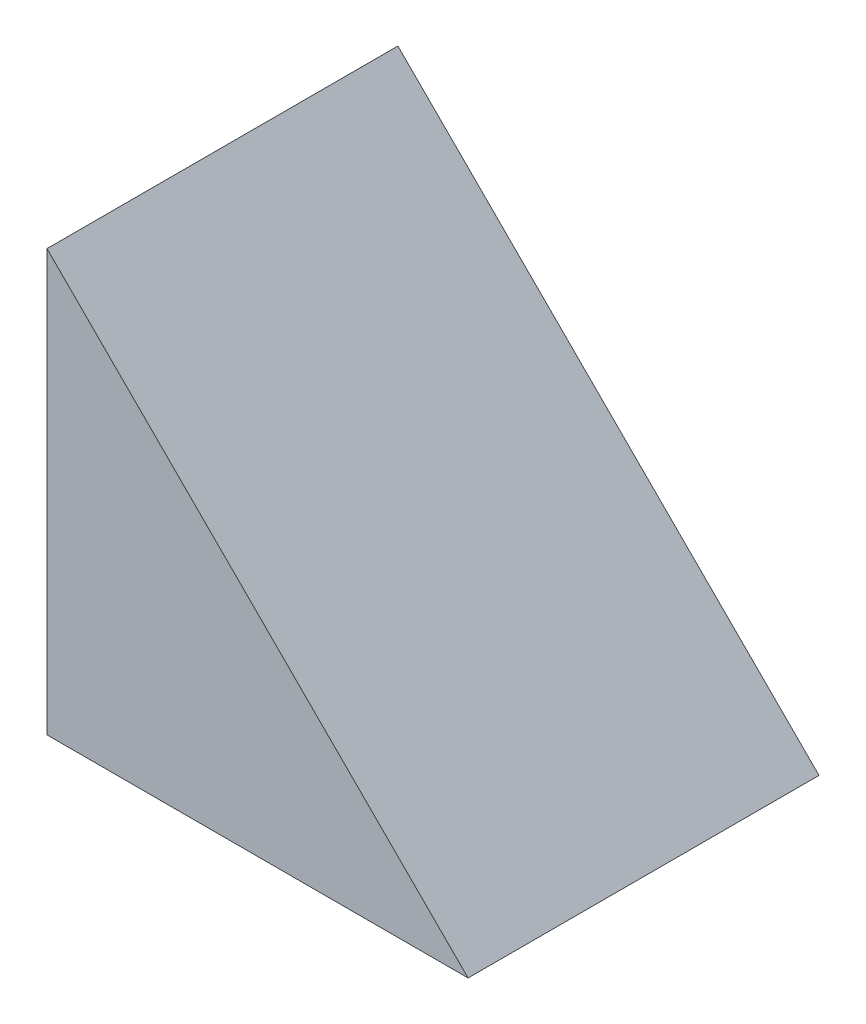
ISO-10303-21;
HEADER;
FILE_DESCRIPTION(('STEP AP214'),'2;1');
FILE_NAME('part.step','',(''),(''),'','','');
FILE_SCHEMA(('AUTOMOTIVE_DESIGN { 1 0 10303 214 1 1 1 1 }'));
ENDSEC;
DATA;
#1=APPLICATION_CONTEXT('core data for automotive mechanical design processes');
#2=APPLICATION_PROTOCOL_DEFINITION('international standard','automotive_design',2000,#1);
#3=PRODUCT_CONTEXT('',#1,'mechanical');
#4=PRODUCT('Part','Part','',(#3));
#5=PRODUCT_RELATED_PRODUCT_CATEGORY('part','',(#4));
#6=PRODUCT_DEFINITION_FORMATION('','',#4);
#7=PRODUCT_DEFINITION_CONTEXT('part definition',#1,'design');
#8=PRODUCT_DEFINITION('design','',#6,#7);
#9=PRODUCT_DEFINITION_SHAPE('','',#8);
#10=(LENGTH_UNIT() NAMED_UNIT(*) SI_UNIT(.MILLI.,.METRE.));
#11=(NAMED_UNIT(*) PLANE_ANGLE_UNIT() SI_UNIT($,.RADIAN.));
#12=(NAMED_UNIT(*) SI_UNIT($,.STERADIAN.) SOLID_ANGLE_UNIT());
#13=UNCERTAINTY_MEASURE_WITH_UNIT(LENGTH_MEASURE(1.E-05),#10,'distance_accuracy_value','');
#14=(GEOMETRIC_REPRESENTATION_CONTEXT(3) GLOBAL_UNCERTAINTY_ASSIGNED_CONTEXT((#13)) GLOBAL_UNIT_ASSIGNED_CONTEXT((#10,
#11,#12)) REPRESENTATION_CONTEXT('',''));
#15=CARTESIAN_POINT('',(0.,0.,0.));
#16=DIRECTION('',(0.,0.,1.));
#17=DIRECTION('',(1.,0.,0.));
#18=AXIS2_PLACEMENT_3D('',#15,#16,#17);
#19=CARTESIAN_POINT('',(0.,76.2,63.5));
#20=DIRECTION('',(1.,0.,0.));
#21=DIRECTION('',(0.,0.,-1.));
#22=AXIS2_PLACEMENT_3D('',#19,#20,#21);
#23=PLANE('',#22);
#24=DIRECTION('',(0.,-1.,0.));
#25=VECTOR('',#24,1.);
#26=CARTESIAN_POINT('',(0.,76.2,0.));
#27=LINE('',#26,#25);
#28=CARTESIAN_POINT('',(0.,76.2,0.));
#29=VERTEX_POINT('',#28);
#30=CARTESIAN_POINT('',(0.,0.,0.));
#31=VERTEX_POINT('',#30);
#32=EDGE_CURVE('E80',#29,#31,#27,.T.);
#33=ORIENTED_EDGE('',*,*,#32,.T.);
#34=DIRECTION('',(0.,0.,-1.));
#35=VECTOR('',#34,1.);
#36=CARTESIAN_POINT('',(0.,0.,63.5));
#37=LINE('',#36,#35);
#38=CARTESIAN_POINT('',(0.,0.,63.5));
#39=VERTEX_POINT('',#38);
#40=EDGE_CURVE('E11',#39,#31,#37,.T.);
#41=ORIENTED_EDGE('',*,*,#40,.F.);
#42=DIRECTION('',(0.,-1.,0.));
#43=VECTOR('',#42,1.);
#44=CARTESIAN_POINT('',(0.,76.2,63.5));
#45=LINE('',#44,#43);
#46=CARTESIAN_POINT('',(0.,76.2,63.5));
#47=VERTEX_POINT('',#46);
#48=EDGE_CURVE('E73',#47,#39,#45,.T.);
#49=ORIENTED_EDGE('',*,*,#48,.F.);
#50=DIRECTION('',(0.,0.,-1.));
#51=VECTOR('',#50,1.);
#52=CARTESIAN_POINT('',(0.,76.2,63.5));
#53=LINE('',#52,#51);
#54=EDGE_CURVE('E81',#47,#29,#53,.T.);
#55=ORIENTED_EDGE('',*,*,#54,.T.);
#56=EDGE_LOOP('',(#33,#41,#49,#55));
#57=FACE_BOUND('',#56,.T.);
#58=ADVANCED_FACE('F33',(#57),#23,.F.);
#59=CARTESIAN_POINT('',(0.,0.,63.5));
#60=DIRECTION('',(0.,1.,0.));
#61=DIRECTION('',(0.,0.,1.));
#62=AXIS2_PLACEMENT_3D('',#59,#60,#61);
#63=PLANE('',#62);
#64=DIRECTION('',(1.,0.,0.));
#65=VECTOR('',#64,1.);
#66=CARTESIAN_POINT('',(0.,0.,0.));
#67=LINE('',#66,#65);
#68=CARTESIAN_POINT('',(76.2,0.,0.));
#69=VERTEX_POINT('',#68);
#70=EDGE_CURVE('E61',#31,#69,#67,.T.);
#71=ORIENTED_EDGE('',*,*,#70,.T.);
#72=DIRECTION('',(0.,0.,-1.));
#73=VECTOR('',#72,1.);
#74=CARTESIAN_POINT('',(76.2,0.,63.5));
#75=LINE('',#74,#73);
#76=CARTESIAN_POINT('',(76.2,0.,63.5));
#77=VERTEX_POINT('',#76);
#78=EDGE_CURVE('E41',#77,#69,#75,.T.);
#79=ORIENTED_EDGE('',*,*,#78,.F.);
#80=DIRECTION('',(1.,0.,0.));
#81=VECTOR('',#80,1.);
#82=CARTESIAN_POINT('',(0.,0.,63.5));
#83=LINE('',#82,#81);
#84=EDGE_CURVE('E69',#39,#77,#83,.T.);
#85=ORIENTED_EDGE('',*,*,#84,.F.);
#86=ORIENTED_EDGE('',*,*,#40,.T.);
#87=EDGE_LOOP('',(#71,#79,#85,#86));
#88=FACE_BOUND('',#87,.T.);
#89=ADVANCED_FACE('F70',(#88),#63,.F.);
#90=CARTESIAN_POINT('',(76.2,0.,63.5));
#91=DIRECTION('',(-0.707106781186548,-0.707106781186548,0.));
#92=DIRECTION('',(0.707106781186548,-0.707106781186548,0.));
#93=AXIS2_PLACEMENT_3D('',#90,#91,#92);
#94=PLANE('',#93);
#95=DIRECTION('',(-0.707106781186547,0.707106781186547,0.));
#96=VECTOR('',#95,1.);
#97=CARTESIAN_POINT('',(76.2,0.,0.));
#98=LINE('',#97,#96);
#99=EDGE_CURVE('E66',#69,#29,#98,.T.);
#100=ORIENTED_EDGE('',*,*,#99,.T.);
#101=ORIENTED_EDGE('',*,*,#54,.F.);
#102=DIRECTION('',(-0.707106781186547,0.707106781186547,0.));
#103=VECTOR('',#102,1.);
#104=CARTESIAN_POINT('',(76.2,0.,63.5));
#105=LINE('',#104,#103);
#106=EDGE_CURVE('E49',#77,#47,#105,.T.);
#107=ORIENTED_EDGE('',*,*,#106,.F.);
#108=ORIENTED_EDGE('',*,*,#78,.T.);
#109=EDGE_LOOP('',(#100,#101,#107,#108));
#110=FACE_BOUND('',#109,.T.);
#111=ADVANCED_FACE('F88',(#110),#94,.F.);
#112=CARTESIAN_POINT('',(0.,0.,63.5));
#113=DIRECTION('',(0.,0.,1.));
#114=DIRECTION('',(1.,0.,0.));
#115=AXIS2_PLACEMENT_3D('',#112,#113,#114);
#116=PLANE('',#115);
#117=ORIENTED_EDGE('',*,*,#48,.T.);
#118=ORIENTED_EDGE('',*,*,#84,.T.);
#119=ORIENTED_EDGE('',*,*,#106,.T.);
#120=EDGE_LOOP('',(#117,#118,#119));
#121=FACE_BOUND('',#120,.T.);
#122=ADVANCED_FACE('F76',(#121),#116,.T.);
#123=CARTESIAN_POINT('',(0.,0.,0.));
#124=DIRECTION('',(0.,0.,1.));
#125=DIRECTION('',(1.,0.,0.));
#126=AXIS2_PLACEMENT_3D('',#123,#124,#125);
#127=PLANE('',#126);
#128=ORIENTED_EDGE('',*,*,#32,.F.);
#129=ORIENTED_EDGE('',*,*,#99,.F.);
#130=ORIENTED_EDGE('',*,*,#70,.F.);
#131=EDGE_LOOP('',(#128,#129,#130));
#132=FACE_BOUND('',#131,.T.);
#133=ADVANCED_FACE('F89',(#132),#127,.F.);
#134=CLOSED_SHELL('',(#58,#89,#111,#122,#133));
#135=MANIFOLD_SOLID_BREP('B2',#134);
#136=ADVANCED_BREP_SHAPE_REPRESENTATION('',(#18,#135),#14);
#137=SHAPE_DEFINITION_REPRESENTATION(#9,#136);
ENDSEC;
END-ISO-10303-21;
